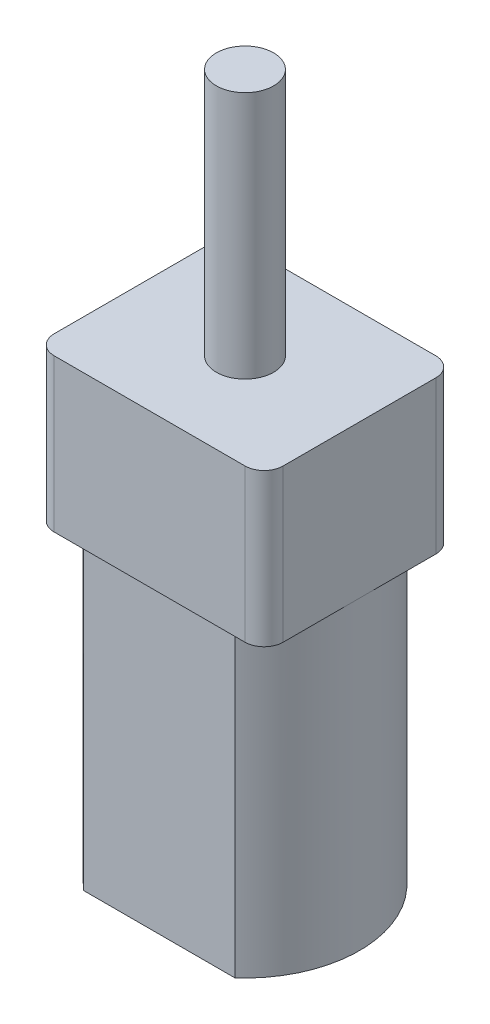
ISO-10303-21;
HEADER;
FILE_DESCRIPTION(('STEP AP214'),'2;1');
FILE_NAME('part.step','',(''),(''),'','','');
FILE_SCHEMA(('AUTOMOTIVE_DESIGN { 1 0 10303 214 1 1 1 1 }'));
ENDSEC;
DATA;
#1=APPLICATION_CONTEXT('core data for automotive mechanical design processes');
#2=APPLICATION_PROTOCOL_DEFINITION('international standard','automotive_design',2000,#1);
#3=PRODUCT_CONTEXT('',#1,'mechanical');
#4=PRODUCT('Part','Part','',(#3));
#5=PRODUCT_RELATED_PRODUCT_CATEGORY('part','',(#4));
#6=PRODUCT_DEFINITION_FORMATION('','',#4);
#7=PRODUCT_DEFINITION_CONTEXT('part definition',#1,'design');
#8=PRODUCT_DEFINITION('design','',#6,#7);
#9=PRODUCT_DEFINITION_SHAPE('','',#8);
#10=(LENGTH_UNIT() NAMED_UNIT(*) SI_UNIT(.MILLI.,.METRE.));
#11=(NAMED_UNIT(*) PLANE_ANGLE_UNIT() SI_UNIT($,.RADIAN.));
#12=(NAMED_UNIT(*) SI_UNIT($,.STERADIAN.) SOLID_ANGLE_UNIT());
#13=UNCERTAINTY_MEASURE_WITH_UNIT(LENGTH_MEASURE(1.E-05),#10,'distance_accuracy_value','');
#14=(GEOMETRIC_REPRESENTATION_CONTEXT(3) GLOBAL_UNCERTAINTY_ASSIGNED_CONTEXT((#13)) GLOBAL_UNIT_ASSIGNED_CONTEXT((#10,
#11,#12)) REPRESENTATION_CONTEXT('',''));
#15=CARTESIAN_POINT('',(0.,0.,0.));
#16=DIRECTION('',(0.,0.,1.));
#17=DIRECTION('',(1.,0.,0.));
#18=AXIS2_PLACEMENT_3D('',#15,#16,#17);
#19=CARTESIAN_POINT('',(6.,24.,-5.));
#20=DIRECTION('',(-1.,0.,0.));
#21=DIRECTION('',(0.,0.,1.));
#22=AXIS2_PLACEMENT_3D('',#19,#20,#21);
#23=PLANE('',#22);
#24=DIRECTION('',(0.,0.,1.));
#25=VECTOR('',#24,1.);
#26=CARTESIAN_POINT('',(6.,16.,-5.));
#27=LINE('',#26,#25);
#28=CARTESIAN_POINT('',(6.,16.,-4.));
#29=VERTEX_POINT('',#28);
#30=CARTESIAN_POINT('',(6.,16.,0.));
#31=VERTEX_POINT('',#30);
#32=EDGE_CURVE('E186',#29,#31,#27,.T.);
#33=ORIENTED_EDGE('',*,*,#32,.F.);
#34=DIRECTION('',(0.,-1.,0.));
#35=VECTOR('',#34,1.);
#36=CARTESIAN_POINT('',(6.,24.,-4.));
#37=LINE('',#36,#35);
#38=CARTESIAN_POINT('',(6.,24.,-4.));
#39=VERTEX_POINT('',#38);
#40=EDGE_CURVE('E292',#29,#39,#37,.F.);
#41=ORIENTED_EDGE('',*,*,#40,.T.);
#42=DIRECTION('',(0.,0.,-1.));
#43=VECTOR('',#42,1.);
#44=CARTESIAN_POINT('',(6.,24.,-5.));
#45=LINE('',#44,#43);
#46=CARTESIAN_POINT('',(6.,24.,4.));
#47=VERTEX_POINT('',#46);
#48=EDGE_CURVE('E247',#47,#39,#45,.T.);
#49=ORIENTED_EDGE('',*,*,#48,.F.);
#50=DIRECTION('',(0.,-1.,0.));
#51=VECTOR('',#50,1.);
#52=CARTESIAN_POINT('',(6.,24.,4.));
#53=LINE('',#52,#51);
#54=CARTESIAN_POINT('',(6.,16.,4.));
#55=VERTEX_POINT('',#54);
#56=EDGE_CURVE('E288',#47,#55,#53,.T.);
#57=ORIENTED_EDGE('',*,*,#56,.T.);
#58=EDGE_CURVE('E233',#31,#55,#27,.T.);
#59=ORIENTED_EDGE('',*,*,#58,.F.);
#60=EDGE_LOOP('',(#33,#41,#49,#57,#59));
#61=FACE_BOUND('',#60,.T.);
#62=ADVANCED_FACE('F66',(#61),#23,.F.);
#63=CARTESIAN_POINT('',(-6.,24.,-5.));
#64=DIRECTION('',(0.,0.,1.));
#65=DIRECTION('',(1.,0.,0.));
#66=AXIS2_PLACEMENT_3D('',#63,#64,#65);
#67=PLANE('',#66);
#68=DIRECTION('',(1.,0.,0.));
#69=VECTOR('',#68,1.);
#70=CARTESIAN_POINT('',(-6.,16.,-5.));
#71=LINE('',#70,#69);
#72=CARTESIAN_POINT('',(-5.,16.,-5.));
#73=VERTEX_POINT('',#72);
#74=CARTESIAN_POINT('',(5.,16.,-5.));
#75=VERTEX_POINT('',#74);
#76=EDGE_CURVE('E244',#73,#75,#71,.T.);
#77=ORIENTED_EDGE('',*,*,#76,.F.);
#78=DIRECTION('',(0.,-1.,0.));
#79=VECTOR('',#78,1.);
#80=CARTESIAN_POINT('',(-5.,24.,-5.));
#81=LINE('',#80,#79);
#82=CARTESIAN_POINT('',(-5.,24.,-5.));
#83=VERTEX_POINT('',#82);
#84=EDGE_CURVE('E273',#73,#83,#81,.F.);
#85=ORIENTED_EDGE('',*,*,#84,.T.);
#86=DIRECTION('',(-1.,0.,0.));
#87=VECTOR('',#86,1.);
#88=CARTESIAN_POINT('',(-6.,24.,-5.));
#89=LINE('',#88,#87);
#90=CARTESIAN_POINT('',(5.,24.,-5.));
#91=VERTEX_POINT('',#90);
#92=EDGE_CURVE('E251',#91,#83,#89,.T.);
#93=ORIENTED_EDGE('',*,*,#92,.F.);
#94=DIRECTION('',(0.,-1.,0.));
#95=VECTOR('',#94,1.);
#96=CARTESIAN_POINT('',(5.,24.,-5.));
#97=LINE('',#96,#95);
#98=EDGE_CURVE('E269',#91,#75,#97,.T.);
#99=ORIENTED_EDGE('',*,*,#98,.T.);
#100=EDGE_LOOP('',(#77,#85,#93,#99));
#101=FACE_BOUND('',#100,.T.);
#102=ADVANCED_FACE('F322',(#101),#67,.F.);
#103=CARTESIAN_POINT('',(-6.,24.,-5.));
#104=DIRECTION('',(1.,0.,0.));
#105=DIRECTION('',(0.,0.,-1.));
#106=AXIS2_PLACEMENT_3D('',#103,#104,#105);
#107=PLANE('',#106);
#108=DIRECTION('',(0.,0.,-1.));
#109=VECTOR('',#108,1.);
#110=CARTESIAN_POINT('',(-6.,16.,-5.));
#111=LINE('',#110,#109);
#112=CARTESIAN_POINT('',(-6.,16.,4.));
#113=VERTEX_POINT('',#112);
#114=CARTESIAN_POINT('',(-6.,16.,0.));
#115=VERTEX_POINT('',#114);
#116=EDGE_CURVE('E225',#113,#115,#111,.T.);
#117=ORIENTED_EDGE('',*,*,#116,.F.);
#118=DIRECTION('',(0.,-1.,0.));
#119=VECTOR('',#118,1.);
#120=CARTESIAN_POINT('',(-6.,24.,4.));
#121=LINE('',#120,#119);
#122=CARTESIAN_POINT('',(-6.,24.,4.));
#123=VERTEX_POINT('',#122);
#124=EDGE_CURVE('E262',#113,#123,#121,.F.);
#125=ORIENTED_EDGE('',*,*,#124,.T.);
#126=DIRECTION('',(0.,0.,1.));
#127=VECTOR('',#126,1.);
#128=CARTESIAN_POINT('',(-6.,24.,-5.));
#129=LINE('',#128,#127);
#130=CARTESIAN_POINT('',(-6.,24.,-4.));
#131=VERTEX_POINT('',#130);
#132=EDGE_CURVE('E255',#131,#123,#129,.T.);
#133=ORIENTED_EDGE('',*,*,#132,.F.);
#134=DIRECTION('',(0.,-1.,0.));
#135=VECTOR('',#134,1.);
#136=CARTESIAN_POINT('',(-6.,24.,-4.));
#137=LINE('',#136,#135);
#138=CARTESIAN_POINT('',(-6.,16.,-4.));
#139=VERTEX_POINT('',#138);
#140=EDGE_CURVE('E265',#131,#139,#137,.T.);
#141=ORIENTED_EDGE('',*,*,#140,.T.);
#142=EDGE_CURVE('E229',#115,#139,#111,.T.);
#143=ORIENTED_EDGE('',*,*,#142,.F.);
#144=EDGE_LOOP('',(#117,#125,#133,#141,#143));
#145=FACE_BOUND('',#144,.T.);
#146=ADVANCED_FACE('F331',(#145),#107,.F.);
#147=CARTESIAN_POINT('',(-6.,24.,5.));
#148=DIRECTION('',(0.,0.,-1.));
#149=DIRECTION('',(-1.,0.,0.));
#150=AXIS2_PLACEMENT_3D('',#147,#148,#149);
#151=PLANE('',#150);
#152=DIRECTION('',(-1.,0.,0.));
#153=VECTOR('',#152,1.);
#154=CARTESIAN_POINT('',(-6.,16.,5.));
#155=LINE('',#154,#153);
#156=CARTESIAN_POINT('',(5.,16.,5.));
#157=VERTEX_POINT('',#156);
#158=CARTESIAN_POINT('',(-5.,16.,5.));
#159=VERTEX_POINT('',#158);
#160=EDGE_CURVE('E83',#157,#159,#155,.T.);
#161=ORIENTED_EDGE('',*,*,#160,.F.);
#162=DIRECTION('',(0.,-1.,0.));
#163=VECTOR('',#162,1.);
#164=CARTESIAN_POINT('',(5.,24.,5.));
#165=LINE('',#164,#163);
#166=CARTESIAN_POINT('',(5.,24.,5.));
#167=VERTEX_POINT('',#166);
#168=EDGE_CURVE('E90',#157,#167,#165,.F.);
#169=ORIENTED_EDGE('',*,*,#168,.T.);
#170=DIRECTION('',(1.,0.,0.));
#171=VECTOR('',#170,1.);
#172=CARTESIAN_POINT('',(-6.,24.,5.));
#173=LINE('',#172,#171);
#174=CARTESIAN_POINT('',(-5.,24.,5.));
#175=VERTEX_POINT('',#174);
#176=EDGE_CURVE('E259',#175,#167,#173,.T.);
#177=ORIENTED_EDGE('',*,*,#176,.F.);
#178=DIRECTION('',(0.,-1.,0.));
#179=VECTOR('',#178,1.);
#180=CARTESIAN_POINT('',(-5.,24.,5.));
#181=LINE('',#180,#179);
#182=EDGE_CURVE('E295',#175,#159,#181,.T.);
#183=ORIENTED_EDGE('',*,*,#182,.T.);
#184=EDGE_LOOP('',(#161,#169,#177,#183));
#185=FACE_BOUND('',#184,.T.);
#186=ADVANCED_FACE('F305',(#185),#151,.F.);
#187=CARTESIAN_POINT('',(-5.,24.,-4.));
#188=DIRECTION('',(0.,-1.,0.));
#189=DIRECTION('',(0.,0.,-1.));
#190=AXIS2_PLACEMENT_3D('',#187,#188,#189);
#191=CYLINDRICAL_SURFACE('',#190,1.);
#192=ORIENTED_EDGE('',*,*,#84,.F.);
#193=CARTESIAN_POINT('',(-5.,16.,-4.));
#194=DIRECTION('',(0.,-1.,0.));
#195=DIRECTION('',(0.,0.,-1.));
#196=AXIS2_PLACEMENT_3D('',#193,#194,#195);
#197=CIRCLE('',#196,1.);
#198=EDGE_CURVE('E240',#73,#139,#197,.F.);
#199=ORIENTED_EDGE('',*,*,#198,.T.);
#200=ORIENTED_EDGE('',*,*,#140,.F.);
#201=CARTESIAN_POINT('',(-5.,24.,-4.));
#202=DIRECTION('',(0.,1.,0.));
#203=DIRECTION('',(0.,0.,1.));
#204=AXIS2_PLACEMENT_3D('',#201,#202,#203);
#205=CIRCLE('',#204,1.);
#206=EDGE_CURVE('E285',#83,#131,#205,.T.);
#207=ORIENTED_EDGE('',*,*,#206,.F.);
#208=EDGE_LOOP('',(#192,#199,#200,#207));
#209=FACE_BOUND('',#208,.T.);
#210=ADVANCED_FACE('F328',(#209),#191,.T.);
#211=CARTESIAN_POINT('',(5.,24.,-4.));
#212=DIRECTION('',(0.,-1.,0.));
#213=DIRECTION('',(0.,0.,-1.));
#214=AXIS2_PLACEMENT_3D('',#211,#212,#213);
#215=CYLINDRICAL_SURFACE('',#214,1.);
#216=ORIENTED_EDGE('',*,*,#40,.F.);
#217=CARTESIAN_POINT('',(5.,16.,-4.));
#218=DIRECTION('',(0.,-1.,0.));
#219=DIRECTION('',(0.,0.,-1.));
#220=AXIS2_PLACEMENT_3D('',#217,#218,#219);
#221=CIRCLE('',#220,1.);
#222=EDGE_CURVE('E236',#29,#75,#221,.F.);
#223=ORIENTED_EDGE('',*,*,#222,.T.);
#224=ORIENTED_EDGE('',*,*,#98,.F.);
#225=CARTESIAN_POINT('',(5.,24.,-4.));
#226=DIRECTION('',(0.,1.,0.));
#227=DIRECTION('',(0.,0.,1.));
#228=AXIS2_PLACEMENT_3D('',#225,#226,#227);
#229=CIRCLE('',#228,1.);
#230=EDGE_CURVE('E282',#39,#91,#229,.T.);
#231=ORIENTED_EDGE('',*,*,#230,.F.);
#232=EDGE_LOOP('',(#216,#223,#224,#231));
#233=FACE_BOUND('',#232,.T.);
#234=ADVANCED_FACE('F319',(#233),#215,.T.);
#235=CARTESIAN_POINT('',(5.,24.,4.));
#236=DIRECTION('',(0.,-1.,0.));
#237=DIRECTION('',(0.,0.,-1.));
#238=AXIS2_PLACEMENT_3D('',#235,#236,#237);
#239=CYLINDRICAL_SURFACE('',#238,1.);
#240=ORIENTED_EDGE('',*,*,#168,.F.);
#241=CARTESIAN_POINT('',(5.,16.,4.));
#242=DIRECTION('',(0.,-1.,0.));
#243=DIRECTION('',(0.,0.,-1.));
#244=AXIS2_PLACEMENT_3D('',#241,#242,#243);
#245=CIRCLE('',#244,1.);
#246=EDGE_CURVE('E228',#157,#55,#245,.F.);
#247=ORIENTED_EDGE('',*,*,#246,.T.);
#248=ORIENTED_EDGE('',*,*,#56,.F.);
#249=CARTESIAN_POINT('',(5.,24.,4.));
#250=DIRECTION('',(0.,1.,0.));
#251=DIRECTION('',(0.,0.,1.));
#252=AXIS2_PLACEMENT_3D('',#249,#250,#251);
#253=CIRCLE('',#252,1.);
#254=EDGE_CURVE('E279',#167,#47,#253,.T.);
#255=ORIENTED_EDGE('',*,*,#254,.F.);
#256=EDGE_LOOP('',(#240,#247,#248,#255));
#257=FACE_BOUND('',#256,.T.);
#258=ADVANCED_FACE('F312',(#257),#239,.T.);
#259=CARTESIAN_POINT('',(-5.,24.,4.));
#260=DIRECTION('',(0.,-1.,0.));
#261=DIRECTION('',(0.,0.,-1.));
#262=AXIS2_PLACEMENT_3D('',#259,#260,#261);
#263=CYLINDRICAL_SURFACE('',#262,1.);
#264=ORIENTED_EDGE('',*,*,#124,.F.);
#265=CARTESIAN_POINT('',(-5.,16.,4.));
#266=DIRECTION('',(0.,-1.,0.));
#267=DIRECTION('',(0.,0.,-1.));
#268=AXIS2_PLACEMENT_3D('',#265,#266,#267);
#269=CIRCLE('',#268,1.);
#270=EDGE_CURVE('E70',#113,#159,#269,.F.);
#271=ORIENTED_EDGE('',*,*,#270,.T.);
#272=ORIENTED_EDGE('',*,*,#182,.F.);
#273=CARTESIAN_POINT('',(-5.,24.,4.));
#274=DIRECTION('',(0.,1.,0.));
#275=DIRECTION('',(0.,0.,1.));
#276=AXIS2_PLACEMENT_3D('',#273,#274,#275);
#277=CIRCLE('',#276,1.);
#278=EDGE_CURVE('E276',#123,#175,#277,.T.);
#279=ORIENTED_EDGE('',*,*,#278,.F.);
#280=EDGE_LOOP('',(#264,#271,#272,#279));
#281=FACE_BOUND('',#280,.T.);
#282=ADVANCED_FACE('F68',(#281),#263,.T.);
#283=CARTESIAN_POINT('',(0.,24.,0.));
#284=DIRECTION('',(0.,1.,0.));
#285=DIRECTION('',(0.,0.,1.));
#286=AXIS2_PLACEMENT_3D('',#283,#284,#285);
#287=PLANE('',#286);
#288=CARTESIAN_POINT('',(0.,24.,0.));
#289=DIRECTION('',(0.,1.,0.));
#290=DIRECTION('',(0.,0.,1.));
#291=AXIS2_PLACEMENT_3D('',#288,#289,#290);
#292=CIRCLE('',#291,1.5);
#293=CARTESIAN_POINT('',(0.,24.,-1.5));
#294=VERTEX_POINT('',#293);
#295=EDGE_CURVE('E13',#294,#294,#292,.T.);
#296=ORIENTED_EDGE('',*,*,#295,.F.);
#297=EDGE_LOOP('',(#296));
#298=FACE_BOUND('',#297,.T.);
#299=ORIENTED_EDGE('',*,*,#92,.T.);
#300=ORIENTED_EDGE('',*,*,#206,.T.);
#301=ORIENTED_EDGE('',*,*,#132,.T.);
#302=ORIENTED_EDGE('',*,*,#278,.T.);
#303=ORIENTED_EDGE('',*,*,#176,.T.);
#304=ORIENTED_EDGE('',*,*,#254,.T.);
#305=ORIENTED_EDGE('',*,*,#48,.T.);
#306=ORIENTED_EDGE('',*,*,#230,.T.);
#307=EDGE_LOOP('',(#299,#300,#301,#302,#303,#304,#305,#306));
#308=FACE_BOUND('',#307,.T.);
#309=ADVANCED_FACE('F308',(#298,#308),#287,.T.);
#310=CARTESIAN_POINT('',(0.,16.,0.));
#311=DIRECTION('',(0.,-1.,0.));
#312=DIRECTION('',(0.,0.,-1.));
#313=AXIS2_PLACEMENT_3D('',#310,#311,#312);
#314=CYLINDRICAL_SURFACE('',#313,6.);
#315=CARTESIAN_POINT('',(0.,16.,0.));
#316=DIRECTION('',(0.,-1.,0.));
#317=DIRECTION('',(0.,0.,-1.));
#318=AXIS2_PLACEMENT_3D('',#315,#316,#317);
#319=CIRCLE('',#318,6.);
#320=CARTESIAN_POINT('',(-3.96862696659689,16.,4.5));
#321=VERTEX_POINT('',#320);
#322=EDGE_CURVE('E177',#321,#115,#319,.T.);
#323=ORIENTED_EDGE('',*,*,#322,.T.);
#324=CARTESIAN_POINT('',(-3.96862696659689,16.,-4.5));
#325=VERTEX_POINT('',#324);
#326=EDGE_CURVE('E192',#115,#325,#319,.T.);
#327=ORIENTED_EDGE('',*,*,#326,.T.);
#328=DIRECTION('',(0.,-1.,0.));
#329=VECTOR('',#328,1.);
#330=CARTESIAN_POINT('',(-3.96862696659689,16.,-4.5));
#331=LINE('',#330,#329);
#332=CARTESIAN_POINT('',(-3.96862696659689,0.,-4.5));
#333=VERTEX_POINT('',#332);
#334=EDGE_CURVE('E195',#325,#333,#331,.T.);
#335=ORIENTED_EDGE('',*,*,#334,.T.);
#336=CARTESIAN_POINT('',(0.,0.,0.));
#337=DIRECTION('',(0.,-1.,0.));
#338=DIRECTION('',(0.,0.,-1.));
#339=AXIS2_PLACEMENT_3D('',#336,#337,#338);
#340=CIRCLE('',#339,6.);
#341=CARTESIAN_POINT('',(-3.96862696659689,0.,4.5));
#342=VERTEX_POINT('',#341);
#343=EDGE_CURVE('E197',#342,#333,#340,.T.);
#344=ORIENTED_EDGE('',*,*,#343,.F.);
#345=DIRECTION('',(0.,-1.,0.));
#346=VECTOR('',#345,1.);
#347=CARTESIAN_POINT('',(-3.96862696659689,16.,4.5));
#348=LINE('',#347,#346);
#349=EDGE_CURVE('E218',#321,#342,#348,.T.);
#350=ORIENTED_EDGE('',*,*,#349,.F.);
#351=EDGE_LOOP('',(#323,#327,#335,#344,#350));
#352=FACE_BOUND('',#351,.T.);
#353=ADVANCED_FACE('F338',(#352),#314,.T.);
#354=CARTESIAN_POINT('',(3.96862696659689,16.,-4.5));
#355=VERTEX_POINT('',#354);
#356=EDGE_CURVE('E167',#355,#31,#319,.T.);
#357=ORIENTED_EDGE('',*,*,#356,.T.);
#358=CARTESIAN_POINT('',(3.96862696659689,16.,4.5));
#359=VERTEX_POINT('',#358);
#360=EDGE_CURVE('E190',#31,#359,#319,.T.);
#361=ORIENTED_EDGE('',*,*,#360,.T.);
#362=DIRECTION('',(0.,-1.,0.));
#363=VECTOR('',#362,1.);
#364=CARTESIAN_POINT('',(3.96862696659689,16.,4.5));
#365=LINE('',#364,#363);
#366=CARTESIAN_POINT('',(3.96862696659689,0.,4.5));
#367=VERTEX_POINT('',#366);
#368=EDGE_CURVE('E176',#359,#367,#365,.T.);
#369=ORIENTED_EDGE('',*,*,#368,.T.);
#370=CARTESIAN_POINT('',(3.96862696659689,0.,-4.5));
#371=VERTEX_POINT('',#370);
#372=EDGE_CURVE('E170',#371,#367,#340,.T.);
#373=ORIENTED_EDGE('',*,*,#372,.F.);
#374=DIRECTION('',(0.,-1.,0.));
#375=VECTOR('',#374,1.);
#376=CARTESIAN_POINT('',(3.96862696659689,16.,-4.5));
#377=LINE('',#376,#375);
#378=EDGE_CURVE('E164',#355,#371,#377,.T.);
#379=ORIENTED_EDGE('',*,*,#378,.F.);
#380=EDGE_LOOP('',(#357,#361,#369,#373,#379));
#381=FACE_BOUND('',#380,.T.);
#382=ADVANCED_FACE('F166',(#381),#314,.T.);
#383=CARTESIAN_POINT('',(0.,16.,0.));
#384=DIRECTION('',(0.,-1.,0.));
#385=DIRECTION('',(0.,0.,-1.));
#386=AXIS2_PLACEMENT_3D('',#383,#384,#385);
#387=PLANE('',#386);
#388=ORIENTED_EDGE('',*,*,#76,.T.);
#389=ORIENTED_EDGE('',*,*,#222,.F.);
#390=ORIENTED_EDGE('',*,*,#32,.T.);
#391=ORIENTED_EDGE('',*,*,#356,.F.);
#392=DIRECTION('',(-1.,0.,0.));
#393=VECTOR('',#392,1.);
#394=CARTESIAN_POINT('',(0.,16.,-4.5));
#395=LINE('',#394,#393);
#396=EDGE_CURVE('E183',#355,#325,#395,.T.);
#397=ORIENTED_EDGE('',*,*,#396,.T.);
#398=ORIENTED_EDGE('',*,*,#326,.F.);
#399=ORIENTED_EDGE('',*,*,#142,.T.);
#400=ORIENTED_EDGE('',*,*,#198,.F.);
#401=EDGE_LOOP('',(#388,#389,#390,#391,#397,#398,#399,#400));
#402=FACE_BOUND('',#401,.T.);
#403=ADVANCED_FACE('F181',(#402),#387,.T.);
#404=ORIENTED_EDGE('',*,*,#58,.T.);
#405=ORIENTED_EDGE('',*,*,#246,.F.);
#406=ORIENTED_EDGE('',*,*,#160,.T.);
#407=ORIENTED_EDGE('',*,*,#270,.F.);
#408=ORIENTED_EDGE('',*,*,#116,.T.);
#409=ORIENTED_EDGE('',*,*,#322,.F.);
#410=DIRECTION('',(-1.,0.,0.));
#411=VECTOR('',#410,1.);
#412=CARTESIAN_POINT('',(0.,16.,4.5));
#413=LINE('',#412,#411);
#414=EDGE_CURVE('E189',#359,#321,#413,.T.);
#415=ORIENTED_EDGE('',*,*,#414,.F.);
#416=ORIENTED_EDGE('',*,*,#360,.F.);
#417=EDGE_LOOP('',(#404,#405,#406,#407,#408,#409,#415,#416));
#418=FACE_BOUND('',#417,.T.);
#419=ADVANCED_FACE('F333',(#418),#387,.T.);
#420=CARTESIAN_POINT('',(0.,16.,-4.5));
#421=DIRECTION('',(0.,0.,1.));
#422=DIRECTION('',(1.,0.,0.));
#423=AXIS2_PLACEMENT_3D('',#420,#421,#422);
#424=PLANE('',#423);
#425=DIRECTION('',(-1.,0.,0.));
#426=VECTOR('',#425,1.);
#427=CARTESIAN_POINT('',(0.,0.,-4.5));
#428=LINE('',#427,#426);
#429=EDGE_CURVE('E208',#371,#333,#428,.T.);
#430=ORIENTED_EDGE('',*,*,#429,.T.);
#431=ORIENTED_EDGE('',*,*,#334,.F.);
#432=ORIENTED_EDGE('',*,*,#396,.F.);
#433=ORIENTED_EDGE('',*,*,#378,.T.);
#434=EDGE_LOOP('',(#430,#431,#432,#433));
#435=FACE_BOUND('',#434,.T.);
#436=ADVANCED_FACE('F193',(#435),#424,.F.);
#437=CARTESIAN_POINT('',(0.,16.,4.5));
#438=DIRECTION('',(0.,0.,1.));
#439=DIRECTION('',(1.,0.,0.));
#440=AXIS2_PLACEMENT_3D('',#437,#438,#439);
#441=PLANE('',#440);
#442=DIRECTION('',(-1.,0.,0.));
#443=VECTOR('',#442,1.);
#444=CARTESIAN_POINT('',(0.,0.,4.5));
#445=LINE('',#444,#443);
#446=EDGE_CURVE('E201',#367,#342,#445,.T.);
#447=ORIENTED_EDGE('',*,*,#446,.F.);
#448=ORIENTED_EDGE('',*,*,#368,.F.);
#449=ORIENTED_EDGE('',*,*,#414,.T.);
#450=ORIENTED_EDGE('',*,*,#349,.T.);
#451=EDGE_LOOP('',(#447,#448,#449,#450));
#452=FACE_BOUND('',#451,.T.);
#453=ADVANCED_FACE('F345',(#452),#441,.T.);
#454=CARTESIAN_POINT('',(0.,0.,0.));
#455=DIRECTION('',(0.,1.,0.));
#456=DIRECTION('',(0.,0.,1.));
#457=AXIS2_PLACEMENT_3D('',#454,#455,#456);
#458=PLANE('',#457);
#459=ORIENTED_EDGE('',*,*,#343,.T.);
#460=ORIENTED_EDGE('',*,*,#429,.F.);
#461=ORIENTED_EDGE('',*,*,#372,.T.);
#462=ORIENTED_EDGE('',*,*,#446,.T.);
#463=EDGE_LOOP('',(#459,#460,#461,#462));
#464=FACE_BOUND('',#463,.T.);
#465=ADVANCED_FACE('F348',(#464),#458,.F.);
#466=CARTESIAN_POINT('',(0.,37.,0.));
#467=DIRECTION('',(0.,-1.,0.));
#468=DIRECTION('',(0.,0.,-1.));
#469=AXIS2_PLACEMENT_3D('',#466,#467,#468);
#470=CYLINDRICAL_SURFACE('',#469,1.5);
#471=CARTESIAN_POINT('',(0.,37.,0.));
#472=DIRECTION('',(0.,1.,0.));
#473=DIRECTION('',(0.,0.,1.));
#474=AXIS2_PLACEMENT_3D('',#471,#472,#473);
#475=CIRCLE('',#474,1.5);
#476=CARTESIAN_POINT('',(0.,37.,-1.5));
#477=VERTEX_POINT('',#476);
#478=EDGE_CURVE('E210',#477,#477,#475,.T.);
#479=CARTESIAN_POINT('',(0.,37.,-1.5));
#480=CARTESIAN_POINT('',(0.,36.8645833333333,-1.5));
#481=CARTESIAN_POINT('',(0.,36.7291666666667,-1.5));
#482=CARTESIAN_POINT('',(0.,36.4583333333333,-1.5));
#483=CARTESIAN_POINT('',(0.,36.3229166666667,-1.5));
#484=CARTESIAN_POINT('',(0.,36.0520833333333,-1.5));
#485=CARTESIAN_POINT('',(0.,35.9166666666667,-1.5));
#486=CARTESIAN_POINT('',(0.,35.6458333333333,-1.5));
#487=CARTESIAN_POINT('',(0.,35.5104166666667,-1.5));
#488=CARTESIAN_POINT('',(0.,35.2395833333333,-1.5));
#489=CARTESIAN_POINT('',(0.,35.1041666666667,-1.5));
#490=CARTESIAN_POINT('',(0.,34.8333333333333,-1.5));
#491=CARTESIAN_POINT('',(0.,34.6979166666667,-1.5));
#492=CARTESIAN_POINT('',(0.,34.4270833333333,-1.5));
#493=CARTESIAN_POINT('',(0.,34.2916666666667,-1.5));
#494=CARTESIAN_POINT('',(0.,34.0208333333333,-1.5));
#495=CARTESIAN_POINT('',(0.,33.8854166666667,-1.5));
#496=CARTESIAN_POINT('',(0.,33.6145833333333,-1.5));
#497=CARTESIAN_POINT('',(0.,33.4791666666667,-1.5));
#498=CARTESIAN_POINT('',(0.,33.2083333333333,-1.5));
#499=CARTESIAN_POINT('',(0.,33.0729166666667,-1.5));
#500=CARTESIAN_POINT('',(0.,32.8020833333333,-1.5));
#501=CARTESIAN_POINT('',(0.,32.6666666666667,-1.5));
#502=CARTESIAN_POINT('',(0.,32.3958333333333,-1.5));
#503=CARTESIAN_POINT('',(0.,32.2604166666667,-1.5));
#504=CARTESIAN_POINT('',(0.,31.9895833333333,-1.5));
#505=CARTESIAN_POINT('',(0.,31.8541666666667,-1.5));
#506=CARTESIAN_POINT('',(0.,31.5833333333333,-1.5));
#507=CARTESIAN_POINT('',(0.,31.4479166666667,-1.5));
#508=CARTESIAN_POINT('',(0.,31.1770833333333,-1.5));
#509=CARTESIAN_POINT('',(0.,31.0416666666667,-1.5));
#510=CARTESIAN_POINT('',(0.,30.7708333333333,-1.5));
#511=CARTESIAN_POINT('',(0.,30.6354166666667,-1.5));
#512=CARTESIAN_POINT('',(0.,30.3645833333333,-1.5));
#513=CARTESIAN_POINT('',(0.,30.2291666666667,-1.5));
#514=CARTESIAN_POINT('',(0.,29.9583333333333,-1.5));
#515=CARTESIAN_POINT('',(0.,29.8229166666667,-1.5));
#516=CARTESIAN_POINT('',(0.,29.5520833333333,-1.5));
#517=CARTESIAN_POINT('',(0.,29.4166666666667,-1.5));
#518=CARTESIAN_POINT('',(0.,29.1458333333333,-1.5));
#519=CARTESIAN_POINT('',(0.,29.0104166666667,-1.5));
#520=CARTESIAN_POINT('',(0.,28.7395833333333,-1.5));
#521=CARTESIAN_POINT('',(0.,28.6041666666667,-1.5));
#522=CARTESIAN_POINT('',(0.,28.3333333333333,-1.5));
#523=CARTESIAN_POINT('',(0.,28.1979166666667,-1.5));
#524=CARTESIAN_POINT('',(0.,27.9270833333333,-1.5));
#525=CARTESIAN_POINT('',(0.,27.7916666666667,-1.5));
#526=CARTESIAN_POINT('',(0.,27.5208333333333,-1.5));
#527=CARTESIAN_POINT('',(0.,27.3854166666667,-1.5));
#528=CARTESIAN_POINT('',(0.,27.1145833333333,-1.5));
#529=CARTESIAN_POINT('',(0.,26.9791666666667,-1.5));
#530=CARTESIAN_POINT('',(0.,26.7083333333333,-1.5));
#531=CARTESIAN_POINT('',(0.,26.5729166666667,-1.5));
#532=CARTESIAN_POINT('',(0.,26.3020833333333,-1.5));
#533=CARTESIAN_POINT('',(0.,26.1666666666667,-1.5));
#534=CARTESIAN_POINT('',(0.,25.8958333333333,-1.5));
#535=CARTESIAN_POINT('',(0.,25.7604166666667,-1.5));
#536=CARTESIAN_POINT('',(0.,25.4895833333333,-1.5));
#537=CARTESIAN_POINT('',(0.,25.3541666666667,-1.5));
#538=CARTESIAN_POINT('',(0.,25.0833333333333,-1.5));
#539=CARTESIAN_POINT('',(0.,24.9479166666667,-1.5));
#540=CARTESIAN_POINT('',(0.,24.6770833333333,-1.5));
#541=CARTESIAN_POINT('',(0.,24.5416666666667,-1.5));
#542=CARTESIAN_POINT('',(0.,24.2708333333333,-1.5));
#543=CARTESIAN_POINT('',(0.,24.1354166666667,-1.5));
#544=CARTESIAN_POINT('',(0.,24.,-1.5));
#545=B_SPLINE_CURVE_WITH_KNOTS('',3,(#479,#480,#481,#482,#483,#484,#485,#486,#487,#488,#489,
#490,#491,#492,#493,#494,#495,#496,#497,#498,#499,#500,#501,#502,#503,#504,#505,#506,#507,#508,
#509,#510,#511,#512,#513,#514,#515,#516,#517,#518,#519,#520,#521,#522,#523,#524,#525,#526,#527,
#528,#529,#530,#531,#532,#533,#534,#535,#536,#537,#538,#539,#540,#541,#542,#543,#544),
.UNSPECIFIED.,.F.,.F.,(4,2,2,2,2,2,2,2,2,2,2,2,2,2,2,2,2,2,2,2,2,2,2,2,2,2,2,2,2,2,2,2,4),(0.,
0.406249999999997,0.812499999999994,1.21875,1.62499999999999,2.03125,2.4375,2.84374999999999,
3.25,3.65624999999999,4.0625,4.46874999999999,4.875,5.28124999999999,5.6875,6.09374999999999,
6.5,6.90625,7.31249999999999,7.71874999999999,8.12499999999999,8.53124999999999,
8.93749999999999,9.34374999999999,9.74999999999999,10.15625,10.5625,10.96875,11.375,11.78125,
12.1875,12.59375,13.),.UNSPECIFIED.);
#546=EDGE_CURVE('BSEAM350',#477,#294,#545,.T.);
#547=ORIENTED_EDGE('',*,*,#478,.F.);
#548=ORIENTED_EDGE('',*,*,#295,.T.);
#549=ORIENTED_EDGE('',*,*,#546,.T.);
#550=ORIENTED_EDGE('',*,*,#546,.F.);
#551=EDGE_LOOP('',(#547,#549,#548,#550));
#552=FACE_BOUND('',#551,.T.);
#553=ADVANCED_FACE('F350',(#552),#470,.T.);
#554=CARTESIAN_POINT('',(0.,37.,0.));
#555=DIRECTION('',(0.,1.,0.));
#556=DIRECTION('',(0.,0.,1.));
#557=AXIS2_PLACEMENT_3D('',#554,#555,#556);
#558=PLANE('',#557);
#559=ORIENTED_EDGE('',*,*,#478,.T.);
#560=EDGE_LOOP('',(#559));
#561=FACE_BOUND('',#560,.T.);
#562=ADVANCED_FACE('F356',(#561),#558,.T.);
#563=CLOSED_SHELL('',(#62,#102,#146,#186,#210,#234,#258,#282,#309,#353,#382,#403,#419,#436,#453,
#465,#553,#562));
#564=MANIFOLD_SOLID_BREP('B2',#563);
#565=ADVANCED_BREP_SHAPE_REPRESENTATION('',(#18,#564),#14);
#566=SHAPE_DEFINITION_REPRESENTATION(#9,#565);
ENDSEC;
END-ISO-10303-21;
